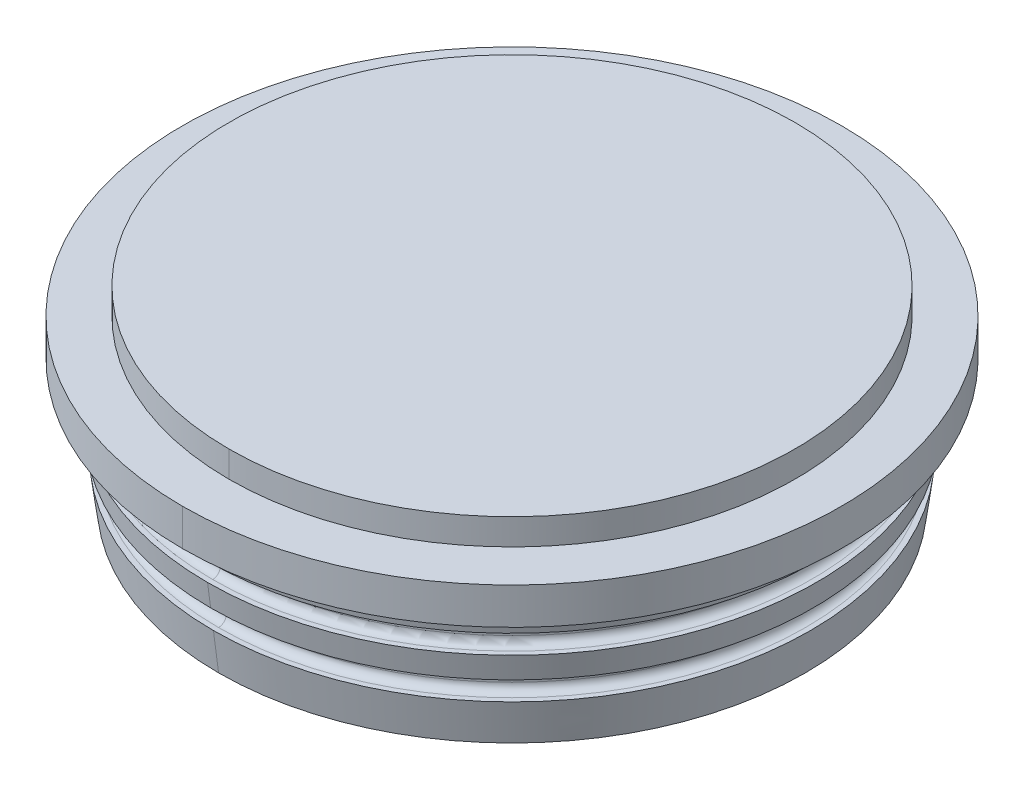
ISO-10303-21;
HEADER;
FILE_DESCRIPTION(('STEP AP214'),'2;1');
FILE_NAME('part.step','',(''),(''),'','','');
FILE_SCHEMA(('AUTOMOTIVE_DESIGN { 1 0 10303 214 1 1 1 1 }'));
ENDSEC;
DATA;
#1=APPLICATION_CONTEXT('core data for automotive mechanical design processes');
#2=APPLICATION_PROTOCOL_DEFINITION('international standard','automotive_design',2000,#1);
#3=PRODUCT_CONTEXT('',#1,'mechanical');
#4=PRODUCT('Part','Part','',(#3));
#5=PRODUCT_RELATED_PRODUCT_CATEGORY('part','',(#4));
#6=PRODUCT_DEFINITION_FORMATION('','',#4);
#7=PRODUCT_DEFINITION_CONTEXT('part definition',#1,'design');
#8=PRODUCT_DEFINITION('design','',#6,#7);
#9=PRODUCT_DEFINITION_SHAPE('','',#8);
#10=(LENGTH_UNIT() NAMED_UNIT(*) SI_UNIT(.MILLI.,.METRE.));
#11=(NAMED_UNIT(*) PLANE_ANGLE_UNIT() SI_UNIT($,.RADIAN.));
#12=(NAMED_UNIT(*) SI_UNIT($,.STERADIAN.) SOLID_ANGLE_UNIT());
#13=UNCERTAINTY_MEASURE_WITH_UNIT(LENGTH_MEASURE(1.E-05),#10,'distance_accuracy_value','');
#14=(GEOMETRIC_REPRESENTATION_CONTEXT(3) GLOBAL_UNCERTAINTY_ASSIGNED_CONTEXT((#13)) GLOBAL_UNIT_ASSIGNED_CONTEXT((#10,
#11,#12)) REPRESENTATION_CONTEXT('',''));
#15=CARTESIAN_POINT('',(0.,0.,0.));
#16=DIRECTION('',(0.,0.,1.));
#17=DIRECTION('',(1.,0.,0.));
#18=AXIS2_PLACEMENT_3D('',#15,#16,#17);
#19=CARTESIAN_POINT('',(0.,-16.5,0.));
#20=DIRECTION('',(0.,-1.,0.));
#21=DIRECTION('',(0.,0.,-1.));
#22=AXIS2_PLACEMENT_3D('',#19,#20,#21);
#23=TOROIDAL_SURFACE('',#22,37.,10.);
#24=CARTESIAN_POINT('',(0.,-16.5,37.));
#25=DIRECTION('',(1.,0.,0.));
#26=DIRECTION('',(0.,0.,-1.));
#27=AXIS2_PLACEMENT_3D('',#24,#25,#26);
#28=CIRCLE('',#27,10.);
#29=CARTESIAN_POINT('',(0.,-6.5,37.));
#30=VERTEX_POINT('',#29);
#31=CARTESIAN_POINT('',(0.,-16.5,47.));
#32=VERTEX_POINT('',#31);
#33=EDGE_CURVE('E217',#30,#32,#28,.T.);
#34=ORIENTED_EDGE('',*,*,#33,.F.);
#35=CARTESIAN_POINT('',(0.,-6.5,0.));
#36=DIRECTION('',(0.,-1.,0.));
#37=DIRECTION('',(0.,0.,-1.));
#38=AXIS2_PLACEMENT_3D('',#35,#36,#37);
#39=CIRCLE('',#38,37.);
#40=CARTESIAN_POINT('',(0.,-6.5,-37.));
#41=VERTEX_POINT('',#40);
#42=EDGE_CURVE('E205',#41,#30,#39,.T.);
#43=ORIENTED_EDGE('',*,*,#42,.F.);
#44=CARTESIAN_POINT('',(0.,-16.5,-37.));
#45=DIRECTION('',(-1.,0.,0.));
#46=DIRECTION('',(0.,0.,1.));
#47=AXIS2_PLACEMENT_3D('',#44,#45,#46);
#48=CIRCLE('',#47,10.);
#49=CARTESIAN_POINT('',(0.,-16.5,-47.));
#50=VERTEX_POINT('',#49);
#51=EDGE_CURVE('E225',#41,#50,#48,.T.);
#52=ORIENTED_EDGE('',*,*,#51,.T.);
#53=CARTESIAN_POINT('',(0.,-16.5,0.));
#54=DIRECTION('',(0.,1.,0.));
#55=DIRECTION('',(0.,0.,-1.));
#56=AXIS2_PLACEMENT_3D('',#53,#54,#55);
#57=CIRCLE('',#56,47.);
#58=EDGE_CURVE('E23',#32,#50,#57,.T.);
#59=ORIENTED_EDGE('',*,*,#58,.F.);
#60=EDGE_LOOP('',(#34,#43,#52,#59));
#61=FACE_BOUND('',#60,.T.);
#62=ADVANCED_FACE('F15',(#61),#23,.F.);
#63=CARTESIAN_POINT('',(0.,-12.5,0.));
#64=DIRECTION('',(0.,-1.,0.));
#65=DIRECTION('',(0.,0.,-1.));
#66=AXIS2_PLACEMENT_3D('',#63,#64,#65);
#67=TOROIDAL_SURFACE('',#66,57.1330499517479,1.5);
#68=CARTESIAN_POINT('',(0.,-12.5,57.1330499517479));
#69=DIRECTION('',(1.,0.,0.));
#70=DIRECTION('',(0.,0.,-1.));
#71=AXIS2_PLACEMENT_3D('',#68,#69,#70);
#72=CIRCLE('',#71,1.5);
#73=CARTESIAN_POINT('',(0.,-12.5,55.6330499517479));
#74=VERTEX_POINT('',#73);
#75=CARTESIAN_POINT('',(0.,-11.,57.1330499517479));
#76=VERTEX_POINT('',#75);
#77=EDGE_CURVE('E239',#74,#76,#72,.T.);
#78=ORIENTED_EDGE('',*,*,#77,.F.);
#79=CARTESIAN_POINT('',(0.,-12.5,0.));
#80=DIRECTION('',(0.,-1.,0.));
#81=DIRECTION('',(0.,0.,-1.));
#82=AXIS2_PLACEMENT_3D('',#79,#80,#81);
#83=CIRCLE('',#82,55.6330499517479);
#84=CARTESIAN_POINT('',(0.,-12.5,-55.6330499517479));
#85=VERTEX_POINT('',#84);
#86=EDGE_CURVE('E390',#85,#74,#83,.T.);
#87=ORIENTED_EDGE('',*,*,#86,.F.);
#88=CARTESIAN_POINT('',(0.,-12.5,-57.1330499517479));
#89=DIRECTION('',(-1.,0.,0.));
#90=DIRECTION('',(0.,0.,1.));
#91=AXIS2_PLACEMENT_3D('',#88,#89,#90);
#92=CIRCLE('',#91,1.5);
#93=CARTESIAN_POINT('',(0.,-11.,-57.1330499517479));
#94=VERTEX_POINT('',#93);
#95=EDGE_CURVE('E256',#85,#94,#92,.T.);
#96=ORIENTED_EDGE('',*,*,#95,.T.);
#97=CARTESIAN_POINT('',(0.,-11.,0.));
#98=DIRECTION('',(0.,1.,0.));
#99=DIRECTION('',(0.,0.,-1.));
#100=AXIS2_PLACEMENT_3D('',#97,#98,#99);
#101=CIRCLE('',#100,57.1330499517479);
#102=EDGE_CURVE('E273',#76,#94,#101,.T.);
#103=ORIENTED_EDGE('',*,*,#102,.F.);
#104=EDGE_LOOP('',(#78,#87,#96,#103));
#105=FACE_BOUND('',#104,.T.);
#106=ADVANCED_FACE('F498',(#105),#67,.F.);
#107=CARTESIAN_POINT('',(0.,-21.,0.));
#108=DIRECTION('',(0.,-1.,0.));
#109=DIRECTION('',(0.,0.,-1.));
#110=AXIS2_PLACEMENT_3D('',#107,#108,#109);
#111=TOROIDAL_SURFACE('',#110,56.0140037222551,1.5);
#112=CARTESIAN_POINT('',(0.,-21.,56.0140037222551));
#113=DIRECTION('',(1.,0.,0.));
#114=DIRECTION('',(0.,0.,-1.));
#115=AXIS2_PLACEMENT_3D('',#112,#113,#114);
#116=CIRCLE('',#115,1.5);
#117=CARTESIAN_POINT('',(0.,-21.,54.5140037222551));
#118=VERTEX_POINT('',#117);
#119=CARTESIAN_POINT('',(0.,-19.5,56.0140037222551));
#120=VERTEX_POINT('',#119);
#121=EDGE_CURVE('E255',#118,#120,#116,.T.);
#122=ORIENTED_EDGE('',*,*,#121,.F.);
#123=CARTESIAN_POINT('',(0.,-21.,0.));
#124=DIRECTION('',(0.,-1.,0.));
#125=DIRECTION('',(0.,0.,-1.));
#126=AXIS2_PLACEMENT_3D('',#123,#124,#125);
#127=CIRCLE('',#126,54.5140037222551);
#128=CARTESIAN_POINT('',(0.,-21.,-54.5140037222551));
#129=VERTEX_POINT('',#128);
#130=EDGE_CURVE('E323',#129,#118,#127,.T.);
#131=ORIENTED_EDGE('',*,*,#130,.F.);
#132=CARTESIAN_POINT('',(0.,-21.,-56.0140037222551));
#133=DIRECTION('',(-1.,0.,0.));
#134=DIRECTION('',(0.,0.,1.));
#135=AXIS2_PLACEMENT_3D('',#132,#133,#134);
#136=CIRCLE('',#135,1.5);
#137=CARTESIAN_POINT('',(0.,-19.5,-56.0140037222551));
#138=VERTEX_POINT('',#137);
#139=EDGE_CURVE('E281',#129,#138,#136,.T.);
#140=ORIENTED_EDGE('',*,*,#139,.T.);
#141=CARTESIAN_POINT('',(0.,-19.5,0.));
#142=DIRECTION('',(0.,1.,0.));
#143=DIRECTION('',(0.,0.,-1.));
#144=AXIS2_PLACEMENT_3D('',#141,#142,#143);
#145=CIRCLE('',#144,56.0140037222551);
#146=EDGE_CURVE('E446',#120,#138,#145,.T.);
#147=ORIENTED_EDGE('',*,*,#146,.F.);
#148=EDGE_LOOP('',(#122,#131,#140,#147));
#149=FACE_BOUND('',#148,.T.);
#150=ADVANCED_FACE('F502',(#149),#111,.F.);
#151=CARTESIAN_POINT('',(0.,-22.,0.));
#152=DIRECTION('',(0.,1.,0.));
#153=DIRECTION('',(0.,0.,1.));
#154=AXIS2_PLACEMENT_3D('',#151,#152,#153);
#155=TOROIDAL_SURFACE('',#154,56.0140037222551,1.5);
#156=CARTESIAN_POINT('',(0.,-22.,-56.0140037222551));
#157=DIRECTION('',(1.,0.,0.));
#158=DIRECTION('',(0.,0.,-1.));
#159=AXIS2_PLACEMENT_3D('',#156,#157,#158);
#160=CIRCLE('',#159,1.5);
#161=CARTESIAN_POINT('',(0.,-22.,-54.5140037222551));
#162=VERTEX_POINT('',#161);
#163=CARTESIAN_POINT('',(0.,-23.5,-56.0140037222551));
#164=VERTEX_POINT('',#163);
#165=EDGE_CURVE('E294',#162,#164,#160,.T.);
#166=ORIENTED_EDGE('',*,*,#165,.F.);
#167=CARTESIAN_POINT('',(0.,-22.,0.));
#168=DIRECTION('',(0.,1.,0.));
#169=DIRECTION('',(0.,0.,1.));
#170=AXIS2_PLACEMENT_3D('',#167,#168,#169);
#171=CIRCLE('',#170,54.5140037222551);
#172=CARTESIAN_POINT('',(0.,-22.,54.5140037222551));
#173=VERTEX_POINT('',#172);
#174=EDGE_CURVE('E378',#173,#162,#171,.T.);
#175=ORIENTED_EDGE('',*,*,#174,.F.);
#176=CARTESIAN_POINT('',(0.,-22.,56.0140037222551));
#177=DIRECTION('',(-1.,0.,0.));
#178=DIRECTION('',(0.,0.,1.));
#179=AXIS2_PLACEMENT_3D('',#176,#177,#178);
#180=CIRCLE('',#179,1.5);
#181=CARTESIAN_POINT('',(0.,-23.5,56.0140037222551));
#182=VERTEX_POINT('',#181);
#183=EDGE_CURVE('E302',#173,#182,#180,.T.);
#184=ORIENTED_EDGE('',*,*,#183,.T.);
#185=CARTESIAN_POINT('',(0.,-23.5,0.));
#186=DIRECTION('',(0.,-1.,0.));
#187=DIRECTION('',(0.,0.,1.));
#188=AXIS2_PLACEMENT_3D('',#185,#186,#187);
#189=CIRCLE('',#188,56.0140037222551);
#190=EDGE_CURVE('E344',#164,#182,#189,.T.);
#191=ORIENTED_EDGE('',*,*,#190,.F.);
#192=EDGE_LOOP('',(#166,#175,#184,#191));
#193=FACE_BOUND('',#192,.T.);
#194=ADVANCED_FACE('F508',(#193),#155,.F.);
#195=CARTESIAN_POINT('',(0.,-13.5,0.));
#196=DIRECTION('',(0.,1.,0.));
#197=DIRECTION('',(0.,0.,1.));
#198=AXIS2_PLACEMENT_3D('',#195,#196,#197);
#199=TOROIDAL_SURFACE('',#198,57.1330499517479,1.5);
#200=CARTESIAN_POINT('',(0.,-13.5,-57.1330499517479));
#201=DIRECTION('',(1.,0.,0.));
#202=DIRECTION('',(0.,0.,-1.));
#203=AXIS2_PLACEMENT_3D('',#200,#201,#202);
#204=CIRCLE('',#203,1.5);
#205=CARTESIAN_POINT('',(0.,-13.5,-55.6330499517479));
#206=VERTEX_POINT('',#205);
#207=CARTESIAN_POINT('',(0.,-15.,-57.1330499517479));
#208=VERTEX_POINT('',#207);
#209=EDGE_CURVE('E312',#206,#208,#204,.T.);
#210=ORIENTED_EDGE('',*,*,#209,.F.);
#211=CARTESIAN_POINT('',(0.,-13.5,0.));
#212=DIRECTION('',(0.,1.,0.));
#213=DIRECTION('',(0.,0.,1.));
#214=AXIS2_PLACEMENT_3D('',#211,#212,#213);
#215=CIRCLE('',#214,55.6330499517479);
#216=CARTESIAN_POINT('',(0.,-13.5,55.6330499517479));
#217=VERTEX_POINT('',#216);
#218=EDGE_CURVE('E398',#217,#206,#215,.T.);
#219=ORIENTED_EDGE('',*,*,#218,.F.);
#220=CARTESIAN_POINT('',(0.,-13.5,57.1330499517479));
#221=DIRECTION('',(-1.,0.,0.));
#222=DIRECTION('',(0.,0.,1.));
#223=AXIS2_PLACEMENT_3D('',#220,#221,#222);
#224=CIRCLE('',#223,1.5);
#225=CARTESIAN_POINT('',(0.,-15.,57.1330499517479));
#226=VERTEX_POINT('',#225);
#227=EDGE_CURVE('E311',#217,#226,#224,.T.);
#228=ORIENTED_EDGE('',*,*,#227,.T.);
#229=CARTESIAN_POINT('',(0.,-15.,0.));
#230=DIRECTION('',(0.,-1.,0.));
#231=DIRECTION('',(0.,0.,1.));
#232=AXIS2_PLACEMENT_3D('',#229,#230,#231);
#233=CIRCLE('',#232,57.1330499517479);
#234=EDGE_CURVE('E242',#208,#226,#233,.T.);
#235=ORIENTED_EDGE('',*,*,#234,.F.);
#236=EDGE_LOOP('',(#210,#219,#228,#235));
#237=FACE_BOUND('',#236,.T.);
#238=ADVANCED_FACE('F474',(#237),#199,.F.);
#239=CARTESIAN_POINT('',(47.,-31.,0.));
#240=DIRECTION('',(0.,-1.,0.));
#241=DIRECTION('',(0.,0.,-1.));
#242=AXIS2_PLACEMENT_3D('',#239,#240,#241);
#243=PLANE('',#242);
#244=CARTESIAN_POINT('',(0.,-31.,0.));
#245=DIRECTION('',(0.,-1.,0.));
#246=DIRECTION('',(0.,0.,-1.));
#247=AXIS2_PLACEMENT_3D('',#244,#245,#246);
#248=CIRCLE('',#247,47.);
#249=CARTESIAN_POINT('',(0.,-31.,-47.));
#250=VERTEX_POINT('',#249);
#251=CARTESIAN_POINT('',(0.,-31.,47.));
#252=VERTEX_POINT('',#251);
#253=EDGE_CURVE('E10',#250,#252,#248,.T.);
#254=ORIENTED_EDGE('',*,*,#253,.F.);
#255=CARTESIAN_POINT('',(0.,-31.,0.));
#256=DIRECTION('',(0.,-1.,0.));
#257=DIRECTION('',(0.,0.,-1.));
#258=AXIS2_PLACEMENT_3D('',#255,#256,#257);
#259=CIRCLE('',#258,47.);
#260=EDGE_CURVE('E282',#252,#250,#259,.T.);
#261=ORIENTED_EDGE('',*,*,#260,.F.);
#262=EDGE_LOOP('',(#254,#261));
#263=FACE_BOUND('',#262,.T.);
#264=CARTESIAN_POINT('',(0.,-31.,0.));
#265=DIRECTION('',(0.,-1.,0.));
#266=DIRECTION('',(0.,0.,-1.));
#267=AXIS2_PLACEMENT_3D('',#264,#265,#266);
#268=CIRCLE('',#267,56.);
#269=CARTESIAN_POINT('',(0.,-31.,56.));
#270=VERTEX_POINT('',#269);
#271=CARTESIAN_POINT('',(0.,-31.,-56.));
#272=VERTEX_POINT('',#271);
#273=EDGE_CURVE('E345',#270,#272,#268,.T.);
#274=ORIENTED_EDGE('',*,*,#273,.T.);
#275=CARTESIAN_POINT('',(0.,-31.,0.));
#276=DIRECTION('',(0.,-1.,0.));
#277=DIRECTION('',(0.,0.,-1.));
#278=AXIS2_PLACEMENT_3D('',#275,#276,#277);
#279=CIRCLE('',#278,56.);
#280=EDGE_CURVE('E377',#272,#270,#279,.T.);
#281=ORIENTED_EDGE('',*,*,#280,.T.);
#282=EDGE_LOOP('',(#274,#281));
#283=FACE_BOUND('',#282,.T.);
#284=ADVANCED_FACE('F471',(#263,#283),#243,.T.);
#285=CARTESIAN_POINT('',(0.,0.,0.));
#286=DIRECTION('',(0.,-1.,0.));
#287=DIRECTION('',(0.,0.,-1.));
#288=AXIS2_PLACEMENT_3D('',#285,#286,#287);
#289=CYLINDRICAL_SURFACE('',#288,47.);
#290=DIRECTION('',(0.,-1.,0.));
#291=VECTOR('',#290,1.);
#292=CARTESIAN_POINT('',(0.,0.,47.));
#293=LINE('',#292,#291);
#294=EDGE_CURVE('E286',#32,#252,#293,.T.);
#295=ORIENTED_EDGE('',*,*,#294,.F.);
#296=ORIENTED_EDGE('',*,*,#58,.T.);
#297=DIRECTION('',(0.,-1.,0.));
#298=VECTOR('',#297,1.);
#299=CARTESIAN_POINT('',(0.,0.,-47.));
#300=LINE('',#299,#298);
#301=EDGE_CURVE('E265',#50,#250,#300,.T.);
#302=ORIENTED_EDGE('',*,*,#301,.T.);
#303=ORIENTED_EDGE('',*,*,#253,.T.);
#304=EDGE_LOOP('',(#295,#296,#302,#303));
#305=FACE_BOUND('',#304,.T.);
#306=ADVANCED_FACE('F466',(#305),#289,.F.);
#307=CARTESIAN_POINT('',(0.,-6.5,0.));
#308=DIRECTION('',(0.,-1.,0.));
#309=DIRECTION('',(0.,0.,-1.));
#310=AXIS2_PLACEMENT_3D('',#307,#308,#309);
#311=PLANE('',#310);
#312=ORIENTED_EDGE('',*,*,#42,.T.);
#313=CARTESIAN_POINT('',(0.,-6.5,0.));
#314=DIRECTION('',(0.,-1.,0.));
#315=DIRECTION('',(0.,0.,-1.));
#316=AXIS2_PLACEMENT_3D('',#313,#314,#315);
#317=CIRCLE('',#316,37.);
#318=EDGE_CURVE('E209',#30,#41,#317,.T.);
#319=ORIENTED_EDGE('',*,*,#318,.T.);
#320=EDGE_LOOP('',(#312,#319));
#321=FACE_BOUND('',#320,.T.);
#322=ADVANCED_FACE('F207',(#321),#311,.T.);
#323=CARTESIAN_POINT('',(54.,5.,0.));
#324=DIRECTION('',(0.,1.,0.));
#325=DIRECTION('',(1.,0.,0.));
#326=AXIS2_PLACEMENT_3D('',#323,#324,#325);
#327=PLANE('',#326);
#328=CARTESIAN_POINT('',(0.,5.,0.));
#329=DIRECTION('',(0.,-1.,0.));
#330=DIRECTION('',(0.,0.,-1.));
#331=AXIS2_PLACEMENT_3D('',#328,#329,#330);
#332=CIRCLE('',#331,54.);
#333=CARTESIAN_POINT('',(0.,5.,-54.));
#334=VERTEX_POINT('',#333);
#335=CARTESIAN_POINT('',(0.,5.,54.));
#336=VERTEX_POINT('',#335);
#337=EDGE_CURVE('E260',#334,#336,#332,.T.);
#338=ORIENTED_EDGE('',*,*,#337,.F.);
#339=CARTESIAN_POINT('',(0.,5.,0.));
#340=DIRECTION('',(0.,-1.,0.));
#341=DIRECTION('',(0.,0.,-1.));
#342=AXIS2_PLACEMENT_3D('',#339,#340,#341);
#343=CIRCLE('',#342,54.);
#344=EDGE_CURVE('E214',#336,#334,#343,.T.);
#345=ORIENTED_EDGE('',*,*,#344,.F.);
#346=EDGE_LOOP('',(#338,#345));
#347=FACE_BOUND('',#346,.T.);
#348=ADVANCED_FACE('F570',(#347),#327,.T.);
#349=CARTESIAN_POINT('',(0.,0.,0.));
#350=DIRECTION('',(0.,-1.,0.));
#351=DIRECTION('',(0.,0.,-1.));
#352=AXIS2_PLACEMENT_3D('',#349,#350,#351);
#353=CYLINDRICAL_SURFACE('',#352,54.);
#354=DIRECTION('',(0.,-1.,0.));
#355=VECTOR('',#354,1.);
#356=CARTESIAN_POINT('',(0.,0.,54.));
#357=LINE('',#356,#355);
#358=CARTESIAN_POINT('',(0.,0.,54.));
#359=VERTEX_POINT('',#358);
#360=EDGE_CURVE('E264',#336,#359,#357,.T.);
#361=ORIENTED_EDGE('',*,*,#360,.F.);
#362=ORIENTED_EDGE('',*,*,#344,.T.);
#363=DIRECTION('',(0.,-1.,0.));
#364=VECTOR('',#363,1.);
#365=CARTESIAN_POINT('',(0.,0.,-54.));
#366=LINE('',#365,#364);
#367=CARTESIAN_POINT('',(0.,0.,-54.));
#368=VERTEX_POINT('',#367);
#369=EDGE_CURVE('E341',#334,#368,#366,.T.);
#370=ORIENTED_EDGE('',*,*,#369,.T.);
#371=CARTESIAN_POINT('',(0.,0.,0.));
#372=DIRECTION('',(0.,-1.,0.));
#373=DIRECTION('',(0.,0.,-1.));
#374=AXIS2_PLACEMENT_3D('',#371,#372,#373);
#375=CIRCLE('',#374,54.);
#376=EDGE_CURVE('E408',#359,#368,#375,.T.);
#377=ORIENTED_EDGE('',*,*,#376,.F.);
#378=EDGE_LOOP('',(#361,#362,#370,#377));
#379=FACE_BOUND('',#378,.T.);
#380=ADVANCED_FACE('F566',(#379),#353,.T.);
#381=CARTESIAN_POINT('',(62.9,0.,0.));
#382=DIRECTION('',(0.,1.,0.));
#383=DIRECTION('',(1.,0.,0.));
#384=AXIS2_PLACEMENT_3D('',#381,#382,#383);
#385=PLANE('',#384);
#386=CARTESIAN_POINT('',(0.,0.,0.));
#387=DIRECTION('',(0.,-1.,0.));
#388=DIRECTION('',(0.,0.,-1.));
#389=AXIS2_PLACEMENT_3D('',#386,#387,#388);
#390=CIRCLE('',#389,54.);
#391=EDGE_CURVE('E337',#368,#359,#390,.T.);
#392=ORIENTED_EDGE('',*,*,#391,.T.);
#393=ORIENTED_EDGE('',*,*,#376,.T.);
#394=EDGE_LOOP('',(#392,#393));
#395=FACE_BOUND('',#394,.T.);
#396=CARTESIAN_POINT('',(0.,0.,0.));
#397=DIRECTION('',(0.,-1.,0.));
#398=DIRECTION('',(0.,0.,-1.));
#399=AXIS2_PLACEMENT_3D('',#396,#397,#398);
#400=CIRCLE('',#399,62.9);
#401=CARTESIAN_POINT('',(0.,0.,-62.9));
#402=VERTEX_POINT('',#401);
#403=CARTESIAN_POINT('',(0.,0.,62.9));
#404=VERTEX_POINT('',#403);
#405=EDGE_CURVE('E349',#402,#404,#400,.T.);
#406=ORIENTED_EDGE('',*,*,#405,.F.);
#407=CARTESIAN_POINT('',(0.,0.,0.));
#408=DIRECTION('',(0.,-1.,0.));
#409=DIRECTION('',(0.,0.,-1.));
#410=AXIS2_PLACEMENT_3D('',#407,#408,#409);
#411=CIRCLE('',#410,62.9);
#412=EDGE_CURVE('E451',#404,#402,#411,.T.);
#413=ORIENTED_EDGE('',*,*,#412,.F.);
#414=EDGE_LOOP('',(#406,#413));
#415=FACE_BOUND('',#414,.T.);
#416=ADVANCED_FACE('F520',(#395,#415),#385,.T.);
#417=CARTESIAN_POINT('',(0.,0.,0.));
#418=DIRECTION('',(0.,-1.,0.));
#419=DIRECTION('',(0.,0.,-1.));
#420=AXIS2_PLACEMENT_3D('',#417,#418,#419);
#421=CYLINDRICAL_SURFACE('',#420,62.9);
#422=DIRECTION('',(0.,-1.,0.));
#423=VECTOR('',#422,1.);
#424=CARTESIAN_POINT('',(0.,0.,62.9));
#425=LINE('',#424,#423);
#426=CARTESIAN_POINT('',(0.,-7.,62.9));
#427=VERTEX_POINT('',#426);
#428=EDGE_CURVE('E353',#404,#427,#425,.T.);
#429=ORIENTED_EDGE('',*,*,#428,.F.);
#430=ORIENTED_EDGE('',*,*,#412,.T.);
#431=DIRECTION('',(0.,-1.,0.));
#432=VECTOR('',#431,1.);
#433=CARTESIAN_POINT('',(0.,0.,-62.9));
#434=LINE('',#433,#432);
#435=CARTESIAN_POINT('',(0.,-7.,-62.9));
#436=VERTEX_POINT('',#435);
#437=EDGE_CURVE('E365',#402,#436,#434,.T.);
#438=ORIENTED_EDGE('',*,*,#437,.T.);
#439=CARTESIAN_POINT('',(0.,-7.,0.));
#440=DIRECTION('',(0.,-1.,0.));
#441=DIRECTION('',(0.,0.,-1.));
#442=AXIS2_PLACEMENT_3D('',#439,#440,#441);
#443=CIRCLE('',#442,62.9);
#444=EDGE_CURVE('E272',#427,#436,#443,.T.);
#445=ORIENTED_EDGE('',*,*,#444,.F.);
#446=EDGE_LOOP('',(#429,#430,#438,#445));
#447=FACE_BOUND('',#446,.T.);
#448=ADVANCED_FACE('F516',(#447),#421,.T.);
#449=CARTESIAN_POINT('',(59.1596599420975,-7.,0.));
#450=DIRECTION('',(0.,-1.,0.));
#451=DIRECTION('',(0.,0.,-1.));
#452=AXIS2_PLACEMENT_3D('',#449,#450,#451);
#453=PLANE('',#452);
#454=CARTESIAN_POINT('',(0.,-7.,0.));
#455=DIRECTION('',(0.,-1.,0.));
#456=DIRECTION('',(0.,0.,-1.));
#457=AXIS2_PLACEMENT_3D('',#454,#455,#456);
#458=CIRCLE('',#457,59.1596599420975);
#459=CARTESIAN_POINT('',(0.,-7.,59.1596599420975));
#460=VERTEX_POINT('',#459);
#461=CARTESIAN_POINT('',(0.,-7.,-59.1596599420975));
#462=VERTEX_POINT('',#461);
#463=EDGE_CURVE('E269',#460,#462,#458,.T.);
#464=ORIENTED_EDGE('',*,*,#463,.F.);
#465=CARTESIAN_POINT('',(0.,-7.,0.));
#466=DIRECTION('',(0.,-1.,0.));
#467=DIRECTION('',(0.,0.,-1.));
#468=AXIS2_PLACEMENT_3D('',#465,#466,#467);
#469=CIRCLE('',#468,59.1596599420975);
#470=EDGE_CURVE('E382',#462,#460,#469,.T.);
#471=ORIENTED_EDGE('',*,*,#470,.F.);
#472=EDGE_LOOP('',(#464,#471));
#473=FACE_BOUND('',#472,.T.);
#474=CARTESIAN_POINT('',(0.,-7.,0.));
#475=DIRECTION('',(0.,-1.,0.));
#476=DIRECTION('',(0.,0.,-1.));
#477=AXIS2_PLACEMENT_3D('',#474,#475,#476);
#478=CIRCLE('',#477,62.9);
#479=EDGE_CURVE('E361',#436,#427,#478,.T.);
#480=ORIENTED_EDGE('',*,*,#479,.T.);
#481=ORIENTED_EDGE('',*,*,#444,.T.);
#482=EDGE_LOOP('',(#480,#481));
#483=FACE_BOUND('',#482,.T.);
#484=ADVANCED_FACE('F519',(#473,#483),#453,.T.);
#485=CARTESIAN_POINT('',(0.,-11.,0.));
#486=DIRECTION('',(0.,1.,0.));
#487=DIRECTION('',(0.,0.,1.));
#488=AXIS2_PLACEMENT_3D('',#485,#486,#487);
#489=CONICAL_SURFACE('',#488,58.6330499517479,0.130899693899576);
#490=DIRECTION('',(0.,0.99144486137381,-0.130526192220053));
#491=VECTOR('',#490,1.);
#492=CARTESIAN_POINT('',(0.,-11.,-58.6330499517479));
#493=LINE('',#492,#491);
#494=CARTESIAN_POINT('',(0.,-11.,-58.6330499517479));
#495=VERTEX_POINT('',#494);
#496=EDGE_CURVE('E373',#495,#462,#493,.T.);
#497=ORIENTED_EDGE('',*,*,#496,.F.);
#498=CARTESIAN_POINT('',(0.,-11.,0.));
#499=DIRECTION('',(0.,-1.,0.));
#500=DIRECTION('',(0.,0.,-1.));
#501=AXIS2_PLACEMENT_3D('',#498,#499,#500);
#502=CIRCLE('',#501,58.6330499517479);
#503=CARTESIAN_POINT('',(0.,-11.,58.6330499517479));
#504=VERTEX_POINT('',#503);
#505=EDGE_CURVE('E245',#504,#495,#502,.T.);
#506=ORIENTED_EDGE('',*,*,#505,.F.);
#507=DIRECTION('',(0.,0.99144486137381,0.130526192220053));
#508=VECTOR('',#507,1.);
#509=CARTESIAN_POINT('',(0.,-11.,58.6330499517479));
#510=LINE('',#509,#508);
#511=EDGE_CURVE('E386',#504,#460,#510,.T.);
#512=ORIENTED_EDGE('',*,*,#511,.T.);
#513=ORIENTED_EDGE('',*,*,#463,.T.);
#514=EDGE_LOOP('',(#497,#506,#512,#513));
#515=FACE_BOUND('',#514,.T.);
#516=ADVANCED_FACE('F556',(#515),#489,.T.);
#517=CARTESIAN_POINT('',(55.6330499517479,-11.,0.));
#518=DIRECTION('',(0.,-1.,0.));
#519=DIRECTION('',(0.,0.,-1.));
#520=AXIS2_PLACEMENT_3D('',#517,#518,#519);
#521=PLANE('',#520);
#522=CARTESIAN_POINT('',(0.,-11.,0.));
#523=DIRECTION('',(0.,1.,0.));
#524=DIRECTION('',(0.,0.,-1.));
#525=AXIS2_PLACEMENT_3D('',#522,#523,#524);
#526=CIRCLE('',#525,57.1330499517479);
#527=EDGE_CURVE('E250',#94,#76,#526,.T.);
#528=ORIENTED_EDGE('',*,*,#527,.T.);
#529=ORIENTED_EDGE('',*,*,#102,.T.);
#530=EDGE_LOOP('',(#528,#529));
#531=FACE_BOUND('',#530,.T.);
#532=ORIENTED_EDGE('',*,*,#505,.T.);
#533=CARTESIAN_POINT('',(0.,-11.,0.));
#534=DIRECTION('',(0.,-1.,0.));
#535=DIRECTION('',(0.,0.,-1.));
#536=AXIS2_PLACEMENT_3D('',#533,#534,#535);
#537=CIRCLE('',#536,58.6330499517479);
#538=EDGE_CURVE('E369',#495,#504,#537,.T.);
#539=ORIENTED_EDGE('',*,*,#538,.T.);
#540=EDGE_LOOP('',(#532,#539));
#541=FACE_BOUND('',#540,.T.);
#542=ADVANCED_FACE('F552',(#531,#541),#521,.T.);
#543=CARTESIAN_POINT('',(0.,0.,0.));
#544=DIRECTION('',(0.,-1.,0.));
#545=DIRECTION('',(0.,0.,-1.));
#546=AXIS2_PLACEMENT_3D('',#543,#544,#545);
#547=CYLINDRICAL_SURFACE('',#546,55.6330499517479);
#548=DIRECTION('',(0.,-1.,0.));
#549=VECTOR('',#548,1.);
#550=CARTESIAN_POINT('',(0.,0.,55.6330499517479));
#551=LINE('',#550,#549);
#552=EDGE_CURVE('E394',#74,#217,#551,.T.);
#553=ORIENTED_EDGE('',*,*,#552,.F.);
#554=CARTESIAN_POINT('',(0.,-12.5,0.));
#555=DIRECTION('',(0.,-1.,0.));
#556=DIRECTION('',(0.,0.,-1.));
#557=AXIS2_PLACEMENT_3D('',#554,#555,#556);
#558=CIRCLE('',#557,55.6330499517479);
#559=EDGE_CURVE('E235',#74,#85,#558,.T.);
#560=ORIENTED_EDGE('',*,*,#559,.T.);
#561=DIRECTION('',(0.,-1.,0.));
#562=VECTOR('',#561,1.);
#563=CARTESIAN_POINT('',(0.,0.,-55.6330499517479));
#564=LINE('',#563,#562);
#565=EDGE_CURVE('E402',#85,#206,#564,.T.);
#566=ORIENTED_EDGE('',*,*,#565,.T.);
#567=CARTESIAN_POINT('',(0.,-13.5,0.));
#568=DIRECTION('',(0.,1.,0.));
#569=DIRECTION('',(0.,0.,1.));
#570=AXIS2_PLACEMENT_3D('',#567,#568,#569);
#571=CIRCLE('',#570,55.6330499517479);
#572=EDGE_CURVE('E306',#206,#217,#571,.T.);
#573=ORIENTED_EDGE('',*,*,#572,.T.);
#574=EDGE_LOOP('',(#553,#560,#566,#573));
#575=FACE_BOUND('',#574,.T.);
#576=ADVANCED_FACE('F549',(#575),#547,.T.);
#577=CARTESIAN_POINT('',(58.1064399613983,-15.,0.));
#578=DIRECTION('',(0.,1.,0.));
#579=DIRECTION('',(1.,0.,0.));
#580=AXIS2_PLACEMENT_3D('',#577,#578,#579);
#581=PLANE('',#580);
#582=CARTESIAN_POINT('',(0.,-15.,0.));
#583=DIRECTION('',(0.,-1.,0.));
#584=DIRECTION('',(0.,0.,1.));
#585=AXIS2_PLACEMENT_3D('',#582,#583,#584);
#586=CIRCLE('',#585,57.1330499517479);
#587=EDGE_CURVE('E307',#226,#208,#586,.T.);
#588=ORIENTED_EDGE('',*,*,#587,.T.);
#589=ORIENTED_EDGE('',*,*,#234,.T.);
#590=EDGE_LOOP('',(#588,#589));
#591=FACE_BOUND('',#590,.T.);
#592=CARTESIAN_POINT('',(0.,-15.,0.));
#593=DIRECTION('',(0.,-1.,0.));
#594=DIRECTION('',(0.,0.,-1.));
#595=AXIS2_PLACEMENT_3D('',#592,#593,#594);
#596=CIRCLE('',#595,58.1064399613983);
#597=CARTESIAN_POINT('',(0.,-15.,58.1064399613983));
#598=VERTEX_POINT('',#597);
#599=CARTESIAN_POINT('',(0.,-15.,-58.1064399613983));
#600=VERTEX_POINT('',#599);
#601=EDGE_CURVE('E246',#598,#600,#596,.T.);
#602=ORIENTED_EDGE('',*,*,#601,.F.);
#603=CARTESIAN_POINT('',(0.,-15.,0.));
#604=DIRECTION('',(0.,-1.,0.));
#605=DIRECTION('',(0.,0.,-1.));
#606=AXIS2_PLACEMENT_3D('',#603,#604,#605);
#607=CIRCLE('',#606,58.1064399613983);
#608=EDGE_CURVE('E324',#600,#598,#607,.T.);
#609=ORIENTED_EDGE('',*,*,#608,.F.);
#610=EDGE_LOOP('',(#602,#609));
#611=FACE_BOUND('',#610,.T.);
#612=ADVANCED_FACE('F547',(#591,#611),#581,.T.);
#613=CARTESIAN_POINT('',(0.,-19.5,0.));
#614=DIRECTION('',(0.,1.,0.));
#615=DIRECTION('',(0.,0.,1.));
#616=AXIS2_PLACEMENT_3D('',#613,#614,#615);
#617=CONICAL_SURFACE('',#616,57.5140037222551,0.130899693899575);
#618=DIRECTION('',(0.,0.99144486137381,-0.130526192220052));
#619=VECTOR('',#618,1.);
#620=CARTESIAN_POINT('',(0.,-19.5,-57.5140037222551));
#621=LINE('',#620,#619);
#622=CARTESIAN_POINT('',(0.,-19.5,-57.5140037222551));
#623=VERTEX_POINT('',#622);
#624=EDGE_CURVE('E357',#623,#600,#621,.T.);
#625=ORIENTED_EDGE('',*,*,#624,.F.);
#626=CARTESIAN_POINT('',(0.,-19.5,0.));
#627=DIRECTION('',(0.,-1.,0.));
#628=DIRECTION('',(0.,0.,-1.));
#629=AXIS2_PLACEMENT_3D('',#626,#627,#628);
#630=CIRCLE('',#629,57.5140037222551);
#631=CARTESIAN_POINT('',(0.,-19.5,57.5140037222551));
#632=VERTEX_POINT('',#631);
#633=EDGE_CURVE('E443',#632,#623,#630,.T.);
#634=ORIENTED_EDGE('',*,*,#633,.F.);
#635=DIRECTION('',(0.,0.99144486137381,0.130526192220052));
#636=VECTOR('',#635,1.);
#637=CARTESIAN_POINT('',(0.,-19.5,57.5140037222551));
#638=LINE('',#637,#636);
#639=EDGE_CURVE('E319',#632,#598,#638,.T.);
#640=ORIENTED_EDGE('',*,*,#639,.T.);
#641=ORIENTED_EDGE('',*,*,#601,.T.);
#642=EDGE_LOOP('',(#625,#634,#640,#641));
#643=FACE_BOUND('',#642,.T.);
#644=ADVANCED_FACE('F543',(#643),#617,.T.);
#645=CARTESIAN_POINT('',(54.5140037222551,-19.5,0.));
#646=DIRECTION('',(0.,-1.,0.));
#647=DIRECTION('',(0.,0.,-1.));
#648=AXIS2_PLACEMENT_3D('',#645,#646,#647);
#649=PLANE('',#648);
#650=CARTESIAN_POINT('',(0.,-19.5,0.));
#651=DIRECTION('',(0.,1.,0.));
#652=DIRECTION('',(0.,0.,-1.));
#653=AXIS2_PLACEMENT_3D('',#650,#651,#652);
#654=CIRCLE('',#653,56.0140037222551);
#655=EDGE_CURVE('E277',#138,#120,#654,.T.);
#656=ORIENTED_EDGE('',*,*,#655,.T.);
#657=ORIENTED_EDGE('',*,*,#146,.T.);
#658=EDGE_LOOP('',(#656,#657));
#659=FACE_BOUND('',#658,.T.);
#660=ORIENTED_EDGE('',*,*,#633,.T.);
#661=CARTESIAN_POINT('',(0.,-19.5,0.));
#662=DIRECTION('',(0.,-1.,0.));
#663=DIRECTION('',(0.,0.,-1.));
#664=AXIS2_PLACEMENT_3D('',#661,#662,#663);
#665=CIRCLE('',#664,57.5140037222551);
#666=EDGE_CURVE('E405',#623,#632,#665,.T.);
#667=ORIENTED_EDGE('',*,*,#666,.T.);
#668=EDGE_LOOP('',(#660,#667));
#669=FACE_BOUND('',#668,.T.);
#670=ADVANCED_FACE('F492',(#659,#669),#649,.T.);
#671=CARTESIAN_POINT('',(0.,0.,0.));
#672=DIRECTION('',(0.,-1.,0.));
#673=DIRECTION('',(0.,0.,-1.));
#674=AXIS2_PLACEMENT_3D('',#671,#672,#673);
#675=CYLINDRICAL_SURFACE('',#674,54.5140037222551);
#676=DIRECTION('',(0.,-1.,0.));
#677=VECTOR('',#676,1.);
#678=CARTESIAN_POINT('',(0.,0.,54.5140037222551));
#679=LINE('',#678,#677);
#680=EDGE_CURVE('E421',#118,#173,#679,.T.);
#681=ORIENTED_EDGE('',*,*,#680,.F.);
#682=CARTESIAN_POINT('',(0.,-21.,0.));
#683=DIRECTION('',(0.,-1.,0.));
#684=DIRECTION('',(0.,0.,-1.));
#685=AXIS2_PLACEMENT_3D('',#682,#683,#684);
#686=CIRCLE('',#685,54.5140037222551);
#687=EDGE_CURVE('E251',#118,#129,#686,.T.);
#688=ORIENTED_EDGE('',*,*,#687,.T.);
#689=DIRECTION('',(0.,-1.,0.));
#690=VECTOR('',#689,1.);
#691=CARTESIAN_POINT('',(0.,0.,-54.5140037222551));
#692=LINE('',#691,#690);
#693=EDGE_CURVE('E374',#129,#162,#692,.T.);
#694=ORIENTED_EDGE('',*,*,#693,.T.);
#695=CARTESIAN_POINT('',(0.,-22.,0.));
#696=DIRECTION('',(0.,1.,0.));
#697=DIRECTION('',(0.,0.,1.));
#698=AXIS2_PLACEMENT_3D('',#695,#696,#697);
#699=CIRCLE('',#698,54.5140037222551);
#700=EDGE_CURVE('E290',#162,#173,#699,.T.);
#701=ORIENTED_EDGE('',*,*,#700,.T.);
#702=EDGE_LOOP('',(#681,#688,#694,#701));
#703=FACE_BOUND('',#702,.T.);
#704=ADVANCED_FACE('F483',(#703),#675,.T.);
#705=CARTESIAN_POINT('',(56.9873937319055,-23.5,0.));
#706=DIRECTION('',(0.,1.,0.));
#707=DIRECTION('',(1.,0.,0.));
#708=AXIS2_PLACEMENT_3D('',#705,#706,#707);
#709=PLANE('',#708);
#710=CARTESIAN_POINT('',(0.,-23.5,0.));
#711=DIRECTION('',(0.,-1.,0.));
#712=DIRECTION('',(0.,0.,1.));
#713=AXIS2_PLACEMENT_3D('',#710,#711,#712);
#714=CIRCLE('',#713,56.0140037222551);
#715=EDGE_CURVE('E298',#182,#164,#714,.T.);
#716=ORIENTED_EDGE('',*,*,#715,.T.);
#717=ORIENTED_EDGE('',*,*,#190,.T.);
#718=EDGE_LOOP('',(#716,#717));
#719=FACE_BOUND('',#718,.T.);
#720=CARTESIAN_POINT('',(0.,-23.5,0.));
#721=DIRECTION('',(0.,-1.,0.));
#722=DIRECTION('',(0.,0.,-1.));
#723=AXIS2_PLACEMENT_3D('',#720,#721,#722);
#724=CIRCLE('',#723,56.9873937319055);
#725=CARTESIAN_POINT('',(0.,-23.5,56.9873937319055));
#726=VERTEX_POINT('',#725);
#727=CARTESIAN_POINT('',(0.,-23.5,-56.9873937319055));
#728=VERTEX_POINT('',#727);
#729=EDGE_CURVE('E35',#726,#728,#724,.T.);
#730=ORIENTED_EDGE('',*,*,#729,.F.);
#731=CARTESIAN_POINT('',(0.,-23.5,0.));
#732=DIRECTION('',(0.,-1.,0.));
#733=DIRECTION('',(0.,0.,-1.));
#734=AXIS2_PLACEMENT_3D('',#731,#732,#733);
#735=CIRCLE('',#734,56.9873937319055);
#736=EDGE_CURVE('E435',#728,#726,#735,.T.);
#737=ORIENTED_EDGE('',*,*,#736,.F.);
#738=EDGE_LOOP('',(#730,#737));
#739=FACE_BOUND('',#738,.T.);
#740=ADVANCED_FACE('F481',(#719,#739),#709,.T.);
#741=CARTESIAN_POINT('',(0.,-31.,0.));
#742=DIRECTION('',(0.,1.,0.));
#743=DIRECTION('',(0.,0.,1.));
#744=AXIS2_PLACEMENT_3D('',#741,#742,#743);
#745=CONICAL_SURFACE('',#744,56.,0.130899693899576);
#746=DIRECTION('',(0.,0.99144486137381,-0.130526192220053));
#747=VECTOR('',#746,1.);
#748=CARTESIAN_POINT('',(0.,-31.,-56.));
#749=LINE('',#748,#747);
#750=EDGE_CURVE('E431',#272,#728,#749,.T.);
#751=ORIENTED_EDGE('',*,*,#750,.F.);
#752=ORIENTED_EDGE('',*,*,#273,.F.);
#753=DIRECTION('',(0.,0.99144486137381,0.130526192220053));
#754=VECTOR('',#753,1.);
#755=CARTESIAN_POINT('',(0.,-31.,56.));
#756=LINE('',#755,#754);
#757=EDGE_CURVE('E411',#270,#726,#756,.T.);
#758=ORIENTED_EDGE('',*,*,#757,.T.);
#759=ORIENTED_EDGE('',*,*,#729,.T.);
#760=EDGE_LOOP('',(#751,#752,#758,#759));
#761=FACE_BOUND('',#760,.T.);
#762=ADVANCED_FACE('F478',(#761),#745,.T.);
#763=CARTESIAN_POINT('',(0.,-31.,0.));
#764=DIRECTION('',(0.,1.,0.));
#765=DIRECTION('',(0.,0.,1.));
#766=AXIS2_PLACEMENT_3D('',#763,#764,#765);
#767=CONICAL_SURFACE('',#766,56.,0.130899693899576);
#768=ORIENTED_EDGE('',*,*,#280,.F.);
#769=ORIENTED_EDGE('',*,*,#750,.T.);
#770=ORIENTED_EDGE('',*,*,#736,.T.);
#771=ORIENTED_EDGE('',*,*,#757,.F.);
#772=EDGE_LOOP('',(#768,#769,#770,#771));
#773=FACE_BOUND('',#772,.T.);
#774=ADVANCED_FACE('F480',(#773),#767,.T.);
#775=CARTESIAN_POINT('',(0.,0.,0.));
#776=DIRECTION('',(0.,-1.,0.));
#777=DIRECTION('',(0.,0.,-1.));
#778=AXIS2_PLACEMENT_3D('',#775,#776,#777);
#779=CYLINDRICAL_SURFACE('',#778,54.5140037222551);
#780=ORIENTED_EDGE('',*,*,#130,.T.);
#781=ORIENTED_EDGE('',*,*,#680,.T.);
#782=ORIENTED_EDGE('',*,*,#174,.T.);
#783=ORIENTED_EDGE('',*,*,#693,.F.);
#784=EDGE_LOOP('',(#780,#781,#782,#783));
#785=FACE_BOUND('',#784,.T.);
#786=ADVANCED_FACE('F533',(#785),#779,.T.);
#787=CARTESIAN_POINT('',(0.,-19.5,0.));
#788=DIRECTION('',(0.,1.,0.));
#789=DIRECTION('',(0.,0.,1.));
#790=AXIS2_PLACEMENT_3D('',#787,#788,#789);
#791=CONICAL_SURFACE('',#790,57.5140037222551,0.130899693899575);
#792=ORIENTED_EDGE('',*,*,#666,.F.);
#793=ORIENTED_EDGE('',*,*,#624,.T.);
#794=ORIENTED_EDGE('',*,*,#608,.T.);
#795=ORIENTED_EDGE('',*,*,#639,.F.);
#796=EDGE_LOOP('',(#792,#793,#794,#795));
#797=FACE_BOUND('',#796,.T.);
#798=ADVANCED_FACE('F536',(#797),#791,.T.);
#799=CARTESIAN_POINT('',(0.,0.,0.));
#800=DIRECTION('',(0.,-1.,0.));
#801=DIRECTION('',(0.,0.,-1.));
#802=AXIS2_PLACEMENT_3D('',#799,#800,#801);
#803=CYLINDRICAL_SURFACE('',#802,55.6330499517479);
#804=ORIENTED_EDGE('',*,*,#86,.T.);
#805=ORIENTED_EDGE('',*,*,#552,.T.);
#806=ORIENTED_EDGE('',*,*,#218,.T.);
#807=ORIENTED_EDGE('',*,*,#565,.F.);
#808=EDGE_LOOP('',(#804,#805,#806,#807));
#809=FACE_BOUND('',#808,.T.);
#810=ADVANCED_FACE('F529',(#809),#803,.T.);
#811=CARTESIAN_POINT('',(0.,-11.,0.));
#812=DIRECTION('',(0.,1.,0.));
#813=DIRECTION('',(0.,0.,1.));
#814=AXIS2_PLACEMENT_3D('',#811,#812,#813);
#815=CONICAL_SURFACE('',#814,58.6330499517479,0.130899693899576);
#816=ORIENTED_EDGE('',*,*,#538,.F.);
#817=ORIENTED_EDGE('',*,*,#496,.T.);
#818=ORIENTED_EDGE('',*,*,#470,.T.);
#819=ORIENTED_EDGE('',*,*,#511,.F.);
#820=EDGE_LOOP('',(#816,#817,#818,#819));
#821=FACE_BOUND('',#820,.T.);
#822=ADVANCED_FACE('F525',(#821),#815,.T.);
#823=CARTESIAN_POINT('',(0.,0.,0.));
#824=DIRECTION('',(0.,-1.,0.));
#825=DIRECTION('',(0.,0.,-1.));
#826=AXIS2_PLACEMENT_3D('',#823,#824,#825);
#827=CYLINDRICAL_SURFACE('',#826,62.9);
#828=ORIENTED_EDGE('',*,*,#405,.T.);
#829=ORIENTED_EDGE('',*,*,#428,.T.);
#830=ORIENTED_EDGE('',*,*,#479,.F.);
#831=ORIENTED_EDGE('',*,*,#437,.F.);
#832=EDGE_LOOP('',(#828,#829,#830,#831));
#833=FACE_BOUND('',#832,.T.);
#834=ADVANCED_FACE('F522',(#833),#827,.T.);
#835=CARTESIAN_POINT('',(0.,0.,0.));
#836=DIRECTION('',(0.,-1.,0.));
#837=DIRECTION('',(0.,0.,-1.));
#838=AXIS2_PLACEMENT_3D('',#835,#836,#837);
#839=CYLINDRICAL_SURFACE('',#838,54.);
#840=ORIENTED_EDGE('',*,*,#337,.T.);
#841=ORIENTED_EDGE('',*,*,#360,.T.);
#842=ORIENTED_EDGE('',*,*,#391,.F.);
#843=ORIENTED_EDGE('',*,*,#369,.F.);
#844=EDGE_LOOP('',(#840,#841,#842,#843));
#845=FACE_BOUND('',#844,.T.);
#846=ADVANCED_FACE('F514',(#845),#839,.T.);
#847=CARTESIAN_POINT('',(0.,0.,0.));
#848=DIRECTION('',(0.,-1.,0.));
#849=DIRECTION('',(0.,0.,-1.));
#850=AXIS2_PLACEMENT_3D('',#847,#848,#849);
#851=CYLINDRICAL_SURFACE('',#850,47.);
#852=CARTESIAN_POINT('',(0.,-16.5,0.));
#853=DIRECTION('',(0.,1.,0.));
#854=DIRECTION('',(0.,0.,-1.));
#855=AXIS2_PLACEMENT_3D('',#852,#853,#854);
#856=CIRCLE('',#855,47.);
#857=EDGE_CURVE('E222',#50,#32,#856,.T.);
#858=ORIENTED_EDGE('',*,*,#857,.T.);
#859=ORIENTED_EDGE('',*,*,#294,.T.);
#860=ORIENTED_EDGE('',*,*,#260,.T.);
#861=ORIENTED_EDGE('',*,*,#301,.F.);
#862=EDGE_LOOP('',(#858,#859,#860,#861));
#863=FACE_BOUND('',#862,.T.);
#864=ADVANCED_FACE('F468',(#863),#851,.F.);
#865=CARTESIAN_POINT('',(0.,-13.5,0.));
#866=DIRECTION('',(0.,1.,0.));
#867=DIRECTION('',(0.,0.,1.));
#868=AXIS2_PLACEMENT_3D('',#865,#866,#867);
#869=TOROIDAL_SURFACE('',#868,57.1330499517479,1.5);
#870=ORIENTED_EDGE('',*,*,#572,.F.);
#871=ORIENTED_EDGE('',*,*,#209,.T.);
#872=ORIENTED_EDGE('',*,*,#587,.F.);
#873=ORIENTED_EDGE('',*,*,#227,.F.);
#874=EDGE_LOOP('',(#870,#871,#872,#873));
#875=FACE_BOUND('',#874,.T.);
#876=ADVANCED_FACE('F619',(#875),#869,.F.);
#877=CARTESIAN_POINT('',(0.,-22.,0.));
#878=DIRECTION('',(0.,1.,0.));
#879=DIRECTION('',(0.,0.,1.));
#880=AXIS2_PLACEMENT_3D('',#877,#878,#879);
#881=TOROIDAL_SURFACE('',#880,56.0140037222551,1.5);
#882=ORIENTED_EDGE('',*,*,#700,.F.);
#883=ORIENTED_EDGE('',*,*,#165,.T.);
#884=ORIENTED_EDGE('',*,*,#715,.F.);
#885=ORIENTED_EDGE('',*,*,#183,.F.);
#886=EDGE_LOOP('',(#882,#883,#884,#885));
#887=FACE_BOUND('',#886,.T.);
#888=ADVANCED_FACE('F590',(#887),#881,.F.);
#889=CARTESIAN_POINT('',(0.,-21.,0.));
#890=DIRECTION('',(0.,-1.,0.));
#891=DIRECTION('',(0.,0.,-1.));
#892=AXIS2_PLACEMENT_3D('',#889,#890,#891);
#893=TOROIDAL_SURFACE('',#892,56.0140037222551,1.5);
#894=ORIENTED_EDGE('',*,*,#687,.F.);
#895=ORIENTED_EDGE('',*,*,#121,.T.);
#896=ORIENTED_EDGE('',*,*,#655,.F.);
#897=ORIENTED_EDGE('',*,*,#139,.F.);
#898=EDGE_LOOP('',(#894,#895,#896,#897));
#899=FACE_BOUND('',#898,.T.);
#900=ADVANCED_FACE('F598',(#899),#893,.F.);
#901=CARTESIAN_POINT('',(0.,-12.5,0.));
#902=DIRECTION('',(0.,-1.,0.));
#903=DIRECTION('',(0.,0.,-1.));
#904=AXIS2_PLACEMENT_3D('',#901,#902,#903);
#905=TOROIDAL_SURFACE('',#904,57.1330499517479,1.5);
#906=ORIENTED_EDGE('',*,*,#559,.F.);
#907=ORIENTED_EDGE('',*,*,#77,.T.);
#908=ORIENTED_EDGE('',*,*,#527,.F.);
#909=ORIENTED_EDGE('',*,*,#95,.F.);
#910=EDGE_LOOP('',(#906,#907,#908,#909));
#911=FACE_BOUND('',#910,.T.);
#912=ADVANCED_FACE('F612',(#911),#905,.F.);
#913=CARTESIAN_POINT('',(0.,-16.5,0.));
#914=DIRECTION('',(0.,-1.,0.));
#915=DIRECTION('',(0.,0.,-1.));
#916=AXIS2_PLACEMENT_3D('',#913,#914,#915);
#917=TOROIDAL_SURFACE('',#916,37.,10.);
#918=ORIENTED_EDGE('',*,*,#318,.F.);
#919=ORIENTED_EDGE('',*,*,#33,.T.);
#920=ORIENTED_EDGE('',*,*,#857,.F.);
#921=ORIENTED_EDGE('',*,*,#51,.F.);
#922=EDGE_LOOP('',(#918,#919,#920,#921));
#923=FACE_BOUND('',#922,.T.);
#924=ADVANCED_FACE('F224',(#923),#917,.F.);
#925=CLOSED_SHELL('',(#62,#106,#150,#194,#238,#284,#306,#322,#348,#380,#416,#448,#484,#516,#542,
#576,#612,#644,#670,#704,#740,#762,#774,#786,#798,#810,#822,#834,#846,#864,#876,#888,#900,#912,#924));
#926=MANIFOLD_SOLID_BREP('B1',#925);
#927=ADVANCED_BREP_SHAPE_REPRESENTATION('',(#18,#926),#14);
#928=SHAPE_DEFINITION_REPRESENTATION(#9,#927);
ENDSEC;
END-ISO-10303-21;
